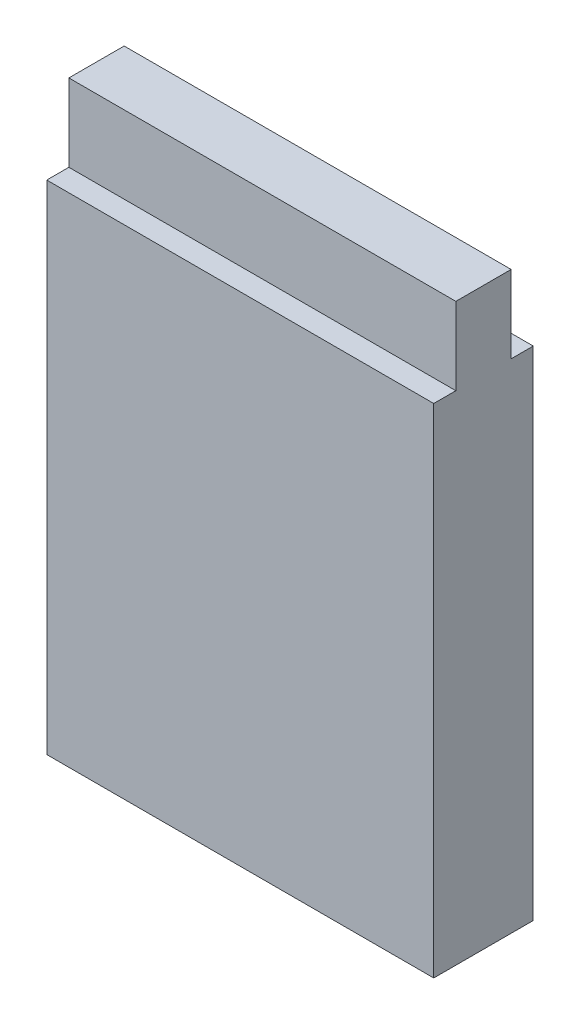
ISO-10303-21;
HEADER;
FILE_DESCRIPTION(('STEP AP214'),'2;1');
FILE_NAME('part.step','',(''),(''),'','','');
FILE_SCHEMA(('AUTOMOTIVE_DESIGN { 1 0 10303 214 1 1 1 1 }'));
ENDSEC;
DATA;
#1=APPLICATION_CONTEXT('core data for automotive mechanical design processes');
#2=APPLICATION_PROTOCOL_DEFINITION('international standard','automotive_design',2000,#1);
#3=PRODUCT_CONTEXT('',#1,'mechanical');
#4=PRODUCT('Part','Part','',(#3));
#5=PRODUCT_RELATED_PRODUCT_CATEGORY('part','',(#4));
#6=PRODUCT_DEFINITION_FORMATION('','',#4);
#7=PRODUCT_DEFINITION_CONTEXT('part definition',#1,'design');
#8=PRODUCT_DEFINITION('design','',#6,#7);
#9=PRODUCT_DEFINITION_SHAPE('','',#8);
#10=(LENGTH_UNIT() NAMED_UNIT(*) SI_UNIT(.MILLI.,.METRE.));
#11=(NAMED_UNIT(*) PLANE_ANGLE_UNIT() SI_UNIT($,.RADIAN.));
#12=(NAMED_UNIT(*) SI_UNIT($,.STERADIAN.) SOLID_ANGLE_UNIT());
#13=UNCERTAINTY_MEASURE_WITH_UNIT(LENGTH_MEASURE(1.E-05),#10,'distance_accuracy_value','');
#14=(GEOMETRIC_REPRESENTATION_CONTEXT(3) GLOBAL_UNCERTAINTY_ASSIGNED_CONTEXT((#13)) GLOBAL_UNIT_ASSIGNED_CONTEXT((#10,
#11,#12)) REPRESENTATION_CONTEXT('',''));
#15=CARTESIAN_POINT('',(0.,0.,0.));
#16=DIRECTION('',(0.,0.,1.));
#17=DIRECTION('',(1.,0.,0.));
#18=AXIS2_PLACEMENT_3D('',#15,#16,#17);
#19=CARTESIAN_POINT('',(17.5,22.5,4.5));
#20=DIRECTION('',(0.,-1.,0.));
#21=DIRECTION('',(1.,0.,0.));
#22=AXIS2_PLACEMENT_3D('',#19,#20,#21);
#23=PLANE('',#22);
#24=DIRECTION('',(-1.,0.,0.));
#25=VECTOR('',#24,1.);
#26=CARTESIAN_POINT('',(17.5,22.5,-2.5));
#27=LINE('',#26,#25);
#28=CARTESIAN_POINT('',(17.5,22.5,-2.5));
#29=VERTEX_POINT('',#28);
#30=CARTESIAN_POINT('',(-17.5,22.5,-2.5));
#31=VERTEX_POINT('',#30);
#32=EDGE_CURVE('E50',#29,#31,#27,.T.);
#33=ORIENTED_EDGE('',*,*,#32,.F.);
#34=DIRECTION('',(0.,0.,-1.));
#35=VECTOR('',#34,1.);
#36=CARTESIAN_POINT('',(17.5,22.5,4.5));
#37=LINE('',#36,#35);
#38=CARTESIAN_POINT('',(17.5,22.5,-4.5));
#39=VERTEX_POINT('',#38);
#40=EDGE_CURVE('E148',#29,#39,#37,.T.);
#41=ORIENTED_EDGE('',*,*,#40,.T.);
#42=DIRECTION('',(-1.,0.,0.));
#43=VECTOR('',#42,1.);
#44=CARTESIAN_POINT('',(17.5,22.5,-4.5));
#45=LINE('',#44,#43);
#46=CARTESIAN_POINT('',(-17.5,22.5,-4.5));
#47=VERTEX_POINT('',#46);
#48=EDGE_CURVE('E136',#39,#47,#45,.T.);
#49=ORIENTED_EDGE('',*,*,#48,.T.);
#50=DIRECTION('',(0.,0.,-1.));
#51=VECTOR('',#50,1.);
#52=CARTESIAN_POINT('',(-17.5,22.5,4.5));
#53=LINE('',#52,#51);
#54=EDGE_CURVE('E55',#31,#47,#53,.T.);
#55=ORIENTED_EDGE('',*,*,#54,.F.);
#56=EDGE_LOOP('',(#33,#41,#49,#55));
#57=FACE_BOUND('',#56,.T.);
#58=ADVANCED_FACE('F35',(#57),#23,.F.);
#59=DIRECTION('',(1.,0.,0.));
#60=VECTOR('',#59,1.);
#61=CARTESIAN_POINT('',(17.5,22.5,2.5));
#62=LINE('',#61,#60);
#63=CARTESIAN_POINT('',(-17.5,22.5,2.5));
#64=VERTEX_POINT('',#63);
#65=CARTESIAN_POINT('',(17.5,22.5,2.5));
#66=VERTEX_POINT('',#65);
#67=EDGE_CURVE('E170',#64,#66,#62,.T.);
#68=ORIENTED_EDGE('',*,*,#67,.F.);
#69=CARTESIAN_POINT('',(-17.5,22.5,4.5));
#70=VERTEX_POINT('',#69);
#71=EDGE_CURVE('E123',#70,#64,#53,.T.);
#72=ORIENTED_EDGE('',*,*,#71,.F.);
#73=DIRECTION('',(-1.,0.,0.));
#74=VECTOR('',#73,1.);
#75=CARTESIAN_POINT('',(17.5,22.5,4.5));
#76=LINE('',#75,#74);
#77=CARTESIAN_POINT('',(17.5,22.5,4.5));
#78=VERTEX_POINT('',#77);
#79=EDGE_CURVE('E140',#78,#70,#76,.T.);
#80=ORIENTED_EDGE('',*,*,#79,.F.);
#81=EDGE_CURVE('E149',#78,#66,#37,.T.);
#82=ORIENTED_EDGE('',*,*,#81,.T.);
#83=EDGE_LOOP('',(#68,#72,#80,#82));
#84=FACE_BOUND('',#83,.T.);
#85=ADVANCED_FACE('F175',(#84),#23,.F.);
#86=CARTESIAN_POINT('',(-17.5,-22.5,4.5));
#87=DIRECTION('',(1.,0.,0.));
#88=DIRECTION('',(0.,0.,-1.));
#89=AXIS2_PLACEMENT_3D('',#86,#87,#88);
#90=PLANE('',#89);
#91=DIRECTION('',(0.,-1.,0.));
#92=VECTOR('',#91,1.);
#93=CARTESIAN_POINT('',(-17.5,-22.5,-4.5));
#94=LINE('',#93,#92);
#95=CARTESIAN_POINT('',(-17.5,-22.5,-4.5));
#96=VERTEX_POINT('',#95);
#97=EDGE_CURVE('E124',#47,#96,#94,.T.);
#98=ORIENTED_EDGE('',*,*,#97,.T.);
#99=DIRECTION('',(0.,0.,-1.));
#100=VECTOR('',#99,1.);
#101=CARTESIAN_POINT('',(-17.5,-22.5,4.5));
#102=LINE('',#101,#100);
#103=CARTESIAN_POINT('',(-17.5,-22.5,4.5));
#104=VERTEX_POINT('',#103);
#105=EDGE_CURVE('E11',#104,#96,#102,.T.);
#106=ORIENTED_EDGE('',*,*,#105,.F.);
#107=DIRECTION('',(0.,-1.,0.));
#108=VECTOR('',#107,1.);
#109=CARTESIAN_POINT('',(-17.5,-22.5,4.5));
#110=LINE('',#109,#108);
#111=EDGE_CURVE('E132',#70,#104,#110,.T.);
#112=ORIENTED_EDGE('',*,*,#111,.F.);
#113=ORIENTED_EDGE('',*,*,#71,.T.);
#114=DIRECTION('',(0.,-1.,0.));
#115=VECTOR('',#114,1.);
#116=CARTESIAN_POINT('',(-17.5,29.5,2.5));
#117=LINE('',#116,#115);
#118=CARTESIAN_POINT('',(-17.5,29.5,2.5));
#119=VERTEX_POINT('',#118);
#120=EDGE_CURVE('E103',#119,#64,#117,.T.);
#121=ORIENTED_EDGE('',*,*,#120,.F.);
#122=DIRECTION('',(0.,0.,1.));
#123=VECTOR('',#122,1.);
#124=CARTESIAN_POINT('',(-17.5,29.5,-2.5));
#125=LINE('',#124,#123);
#126=CARTESIAN_POINT('',(-17.5,29.5,-2.5));
#127=VERTEX_POINT('',#126);
#128=EDGE_CURVE('E109',#127,#119,#125,.T.);
#129=ORIENTED_EDGE('',*,*,#128,.F.);
#130=DIRECTION('',(0.,-1.,0.));
#131=VECTOR('',#130,1.);
#132=CARTESIAN_POINT('',(-17.5,29.5,-2.5));
#133=LINE('',#132,#131);
#134=EDGE_CURVE('E166',#127,#31,#133,.T.);
#135=ORIENTED_EDGE('',*,*,#134,.T.);
#136=ORIENTED_EDGE('',*,*,#54,.T.);
#137=EDGE_LOOP('',(#98,#106,#112,#113,#121,#129,#135,#136));
#138=FACE_BOUND('',#137,.T.);
#139=ADVANCED_FACE('F37',(#138),#90,.F.);
#140=CARTESIAN_POINT('',(17.5,-22.5,4.5));
#141=DIRECTION('',(0.,1.,0.));
#142=DIRECTION('',(0.,0.,1.));
#143=AXIS2_PLACEMENT_3D('',#140,#141,#142);
#144=PLANE('',#143);
#145=DIRECTION('',(1.,0.,0.));
#146=VECTOR('',#145,1.);
#147=CARTESIAN_POINT('',(17.5,-22.5,-4.5));
#148=LINE('',#147,#146);
#149=CARTESIAN_POINT('',(17.5,-22.5,-4.5));
#150=VERTEX_POINT('',#149);
#151=EDGE_CURVE('E126',#96,#150,#148,.T.);
#152=ORIENTED_EDGE('',*,*,#151,.T.);
#153=DIRECTION('',(0.,0.,-1.));
#154=VECTOR('',#153,1.);
#155=CARTESIAN_POINT('',(17.5,-22.5,4.5));
#156=LINE('',#155,#154);
#157=CARTESIAN_POINT('',(17.5,-22.5,4.5));
#158=VERTEX_POINT('',#157);
#159=EDGE_CURVE('E43',#158,#150,#156,.T.);
#160=ORIENTED_EDGE('',*,*,#159,.F.);
#161=DIRECTION('',(1.,0.,0.));
#162=VECTOR('',#161,1.);
#163=CARTESIAN_POINT('',(17.5,-22.5,4.5));
#164=LINE('',#163,#162);
#165=EDGE_CURVE('E135',#104,#158,#164,.T.);
#166=ORIENTED_EDGE('',*,*,#165,.F.);
#167=ORIENTED_EDGE('',*,*,#105,.T.);
#168=EDGE_LOOP('',(#152,#160,#166,#167));
#169=FACE_BOUND('',#168,.T.);
#170=ADVANCED_FACE('F179',(#169),#144,.F.);
#171=CARTESIAN_POINT('',(17.5,-22.5,4.5));
#172=DIRECTION('',(-1.,0.,0.));
#173=DIRECTION('',(0.,0.,1.));
#174=AXIS2_PLACEMENT_3D('',#171,#172,#173);
#175=PLANE('',#174);
#176=DIRECTION('',(0.,1.,0.));
#177=VECTOR('',#176,1.);
#178=CARTESIAN_POINT('',(17.5,-22.5,-4.5));
#179=LINE('',#178,#177);
#180=EDGE_CURVE('E143',#150,#39,#179,.T.);
#181=ORIENTED_EDGE('',*,*,#180,.T.);
#182=ORIENTED_EDGE('',*,*,#40,.F.);
#183=DIRECTION('',(0.,-1.,0.));
#184=VECTOR('',#183,1.);
#185=CARTESIAN_POINT('',(17.5,29.5,-2.5));
#186=LINE('',#185,#184);
#187=CARTESIAN_POINT('',(17.5,29.5,-2.5));
#188=VERTEX_POINT('',#187);
#189=EDGE_CURVE('E128',#188,#29,#186,.T.);
#190=ORIENTED_EDGE('',*,*,#189,.F.);
#191=DIRECTION('',(0.,0.,-1.));
#192=VECTOR('',#191,1.);
#193=CARTESIAN_POINT('',(17.5,29.5,-2.5));
#194=LINE('',#193,#192);
#195=CARTESIAN_POINT('',(17.5,29.5,2.5));
#196=VERTEX_POINT('',#195);
#197=EDGE_CURVE('E108',#196,#188,#194,.T.);
#198=ORIENTED_EDGE('',*,*,#197,.F.);
#199=DIRECTION('',(0.,-1.,0.));
#200=VECTOR('',#199,1.);
#201=CARTESIAN_POINT('',(17.5,29.5,2.5));
#202=LINE('',#201,#200);
#203=EDGE_CURVE('E105',#196,#66,#202,.T.);
#204=ORIENTED_EDGE('',*,*,#203,.T.);
#205=ORIENTED_EDGE('',*,*,#81,.F.);
#206=DIRECTION('',(0.,1.,0.));
#207=VECTOR('',#206,1.);
#208=CARTESIAN_POINT('',(17.5,-22.5,4.5));
#209=LINE('',#208,#207);
#210=EDGE_CURVE('E138',#158,#78,#209,.T.);
#211=ORIENTED_EDGE('',*,*,#210,.F.);
#212=ORIENTED_EDGE('',*,*,#159,.T.);
#213=EDGE_LOOP('',(#181,#182,#190,#198,#204,#205,#211,#212));
#214=FACE_BOUND('',#213,.T.);
#215=ADVANCED_FACE('F155',(#214),#175,.F.);
#216=CARTESIAN_POINT('',(0.,0.,4.5));
#217=DIRECTION('',(0.,0.,1.));
#218=DIRECTION('',(1.,0.,0.));
#219=AXIS2_PLACEMENT_3D('',#216,#217,#218);
#220=PLANE('',#219);
#221=ORIENTED_EDGE('',*,*,#111,.T.);
#222=ORIENTED_EDGE('',*,*,#165,.T.);
#223=ORIENTED_EDGE('',*,*,#210,.T.);
#224=ORIENTED_EDGE('',*,*,#79,.T.);
#225=EDGE_LOOP('',(#221,#222,#223,#224));
#226=FACE_BOUND('',#225,.T.);
#227=ADVANCED_FACE('F177',(#226),#220,.T.);
#228=CARTESIAN_POINT('',(0.,0.,-4.5));
#229=DIRECTION('',(0.,0.,1.));
#230=DIRECTION('',(1.,0.,0.));
#231=AXIS2_PLACEMENT_3D('',#228,#229,#230);
#232=PLANE('',#231);
#233=ORIENTED_EDGE('',*,*,#97,.F.);
#234=ORIENTED_EDGE('',*,*,#48,.F.);
#235=ORIENTED_EDGE('',*,*,#180,.F.);
#236=ORIENTED_EDGE('',*,*,#151,.F.);
#237=EDGE_LOOP('',(#233,#234,#235,#236));
#238=FACE_BOUND('',#237,.T.);
#239=ADVANCED_FACE('F161',(#238),#232,.F.);
#240=CARTESIAN_POINT('',(17.5,29.5,2.5));
#241=DIRECTION('',(0.,0.,-1.));
#242=DIRECTION('',(-1.,0.,0.));
#243=AXIS2_PLACEMENT_3D('',#240,#241,#242);
#244=PLANE('',#243);
#245=ORIENTED_EDGE('',*,*,#67,.T.);
#246=ORIENTED_EDGE('',*,*,#203,.F.);
#247=DIRECTION('',(1.,0.,0.));
#248=VECTOR('',#247,1.);
#249=CARTESIAN_POINT('',(17.5,29.5,2.5));
#250=LINE('',#249,#248);
#251=EDGE_CURVE('E98',#119,#196,#250,.T.);
#252=ORIENTED_EDGE('',*,*,#251,.F.);
#253=ORIENTED_EDGE('',*,*,#120,.T.);
#254=EDGE_LOOP('',(#245,#246,#252,#253));
#255=FACE_BOUND('',#254,.T.);
#256=ADVANCED_FACE('F101',(#255),#244,.F.);
#257=CARTESIAN_POINT('',(17.5,29.5,-2.5));
#258=DIRECTION('',(0.,0.,1.));
#259=DIRECTION('',(1.,0.,0.));
#260=AXIS2_PLACEMENT_3D('',#257,#258,#259);
#261=PLANE('',#260);
#262=ORIENTED_EDGE('',*,*,#32,.T.);
#263=ORIENTED_EDGE('',*,*,#134,.F.);
#264=DIRECTION('',(-1.,0.,0.));
#265=VECTOR('',#264,1.);
#266=CARTESIAN_POINT('',(17.5,29.5,-2.5));
#267=LINE('',#266,#265);
#268=EDGE_CURVE('E114',#188,#127,#267,.T.);
#269=ORIENTED_EDGE('',*,*,#268,.F.);
#270=ORIENTED_EDGE('',*,*,#189,.T.);
#271=EDGE_LOOP('',(#262,#263,#269,#270));
#272=FACE_BOUND('',#271,.T.);
#273=ADVANCED_FACE('F165',(#272),#261,.F.);
#274=CARTESIAN_POINT('',(0.,29.5,0.));
#275=DIRECTION('',(0.,-1.,0.));
#276=DIRECTION('',(1.,0.,0.));
#277=AXIS2_PLACEMENT_3D('',#274,#275,#276);
#278=PLANE('',#277);
#279=ORIENTED_EDGE('',*,*,#128,.T.);
#280=ORIENTED_EDGE('',*,*,#251,.T.);
#281=ORIENTED_EDGE('',*,*,#197,.T.);
#282=ORIENTED_EDGE('',*,*,#268,.T.);
#283=EDGE_LOOP('',(#279,#280,#281,#282));
#284=FACE_BOUND('',#283,.T.);
#285=ADVANCED_FACE('F112',(#284),#278,.F.);
#286=CLOSED_SHELL('',(#58,#85,#139,#170,#215,#227,#239,#256,#273,#285));
#287=MANIFOLD_SOLID_BREP('B2',#286);
#288=ADVANCED_BREP_SHAPE_REPRESENTATION('',(#18,#287),#14);
#289=SHAPE_DEFINITION_REPRESENTATION(#9,#288);
ENDSEC;
END-ISO-10303-21;
